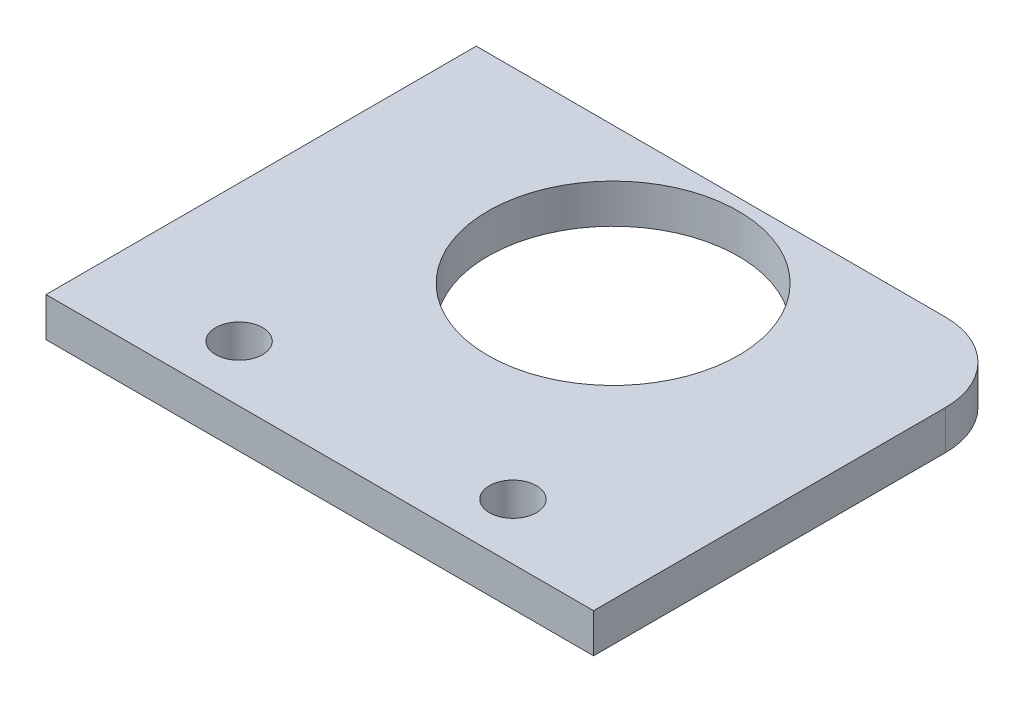
ISO-10303-21;
HEADER;
FILE_DESCRIPTION(('STEP AP214'),'2;1');
FILE_NAME('part.step','',(''),(''),'','','');
FILE_SCHEMA(('AUTOMOTIVE_DESIGN { 1 0 10303 214 1 1 1 1 }'));
ENDSEC;
DATA;
#1=APPLICATION_CONTEXT('core data for automotive mechanical design processes');
#2=APPLICATION_PROTOCOL_DEFINITION('international standard','automotive_design',2000,#1);
#3=PRODUCT_CONTEXT('',#1,'mechanical');
#4=PRODUCT('Part','Part','',(#3));
#5=PRODUCT_RELATED_PRODUCT_CATEGORY('part','',(#4));
#6=PRODUCT_DEFINITION_FORMATION('','',#4);
#7=PRODUCT_DEFINITION_CONTEXT('part definition',#1,'design');
#8=PRODUCT_DEFINITION('design','',#6,#7);
#9=PRODUCT_DEFINITION_SHAPE('','',#8);
#10=(LENGTH_UNIT() NAMED_UNIT(*) SI_UNIT(.MILLI.,.METRE.));
#11=(NAMED_UNIT(*) PLANE_ANGLE_UNIT() SI_UNIT($,.RADIAN.));
#12=(NAMED_UNIT(*) SI_UNIT($,.STERADIAN.) SOLID_ANGLE_UNIT());
#13=UNCERTAINTY_MEASURE_WITH_UNIT(LENGTH_MEASURE(1.E-05),#10,'distance_accuracy_value','');
#14=(GEOMETRIC_REPRESENTATION_CONTEXT(3) GLOBAL_UNCERTAINTY_ASSIGNED_CONTEXT((#13)) GLOBAL_UNIT_ASSIGNED_CONTEXT((#10,
#11,#12)) REPRESENTATION_CONTEXT('',''));
#15=CARTESIAN_POINT('',(0.,0.,0.));
#16=DIRECTION('',(0.,0.,1.));
#17=DIRECTION('',(1.,0.,0.));
#18=AXIS2_PLACEMENT_3D('',#15,#16,#17);
#19=CARTESIAN_POINT('',(0.,5.,0.));
#20=DIRECTION('',(0.,1.,0.));
#21=DIRECTION('',(0.,0.,1.));
#22=AXIS2_PLACEMENT_3D('',#19,#20,#21);
#23=PLANE('',#22);
#24=CARTESIAN_POINT('',(-17.5,5.,20.3108891324554));
#25=DIRECTION('',(0.,1.,0.));
#26=DIRECTION('',(0.,0.,1.));
#27=AXIS2_PLACEMENT_3D('',#24,#25,#26);
#28=CIRCLE('',#27,3.);
#29=CARTESIAN_POINT('',(-17.5,5.,23.3108891324554));
#30=VERTEX_POINT('',#29);
#31=EDGE_CURVE('E237',#30,#30,#28,.T.);
#32=ORIENTED_EDGE('',*,*,#31,.F.);
#33=EDGE_LOOP('',(#32));
#34=FACE_BOUND('',#33,.T.);
#35=CARTESIAN_POINT('',(17.5,5.,20.3108891324554));
#36=DIRECTION('',(0.,1.,0.));
#37=DIRECTION('',(0.,0.,1.));
#38=AXIS2_PLACEMENT_3D('',#35,#36,#37);
#39=CIRCLE('',#38,3.);
#40=CARTESIAN_POINT('',(17.5,5.,23.3108891324554));
#41=VERTEX_POINT('',#40);
#42=EDGE_CURVE('E235',#41,#41,#39,.T.);
#43=ORIENTED_EDGE('',*,*,#42,.F.);
#44=EDGE_LOOP('',(#43));
#45=FACE_BOUND('',#44,.T.);
#46=DIRECTION('',(0.,0.,-1.));
#47=VECTOR('',#46,1.);
#48=CARTESIAN_POINT('',(35.,5.,-27.5));
#49=LINE('',#48,#47);
#50=CARTESIAN_POINT('',(35.,5.,27.5));
#51=VERTEX_POINT('',#50);
#52=CARTESIAN_POINT('',(35.,5.,-17.5));
#53=VERTEX_POINT('',#52);
#54=EDGE_CURVE('E99',#51,#53,#49,.T.);
#55=ORIENTED_EDGE('',*,*,#54,.T.);
#56=CARTESIAN_POINT('',(25.,5.,-17.5));
#57=DIRECTION('',(0.,1.,0.));
#58=DIRECTION('',(0.,0.,1.));
#59=AXIS2_PLACEMENT_3D('',#56,#57,#58);
#60=CIRCLE('',#59,10.);
#61=CARTESIAN_POINT('',(25.,5.,-27.5));
#62=VERTEX_POINT('',#61);
#63=EDGE_CURVE('E11',#53,#62,#60,.T.);
#64=ORIENTED_EDGE('',*,*,#63,.T.);
#65=DIRECTION('',(-1.,0.,0.));
#66=VECTOR('',#65,1.);
#67=CARTESIAN_POINT('',(-35.,5.,-27.5));
#68=LINE('',#67,#66);
#69=CARTESIAN_POINT('',(-35.,5.,-27.5));
#70=VERTEX_POINT('',#69);
#71=EDGE_CURVE('E88',#62,#70,#68,.T.);
#72=ORIENTED_EDGE('',*,*,#71,.T.);
#73=DIRECTION('',(0.,0.,1.));
#74=VECTOR('',#73,1.);
#75=CARTESIAN_POINT('',(-35.,5.,-27.5));
#76=LINE('',#75,#74);
#77=CARTESIAN_POINT('',(-35.,5.,27.5));
#78=VERTEX_POINT('',#77);
#79=EDGE_CURVE('E92',#70,#78,#76,.T.);
#80=ORIENTED_EDGE('',*,*,#79,.T.);
#81=DIRECTION('',(1.,0.,0.));
#82=VECTOR('',#81,1.);
#83=CARTESIAN_POINT('',(-35.,5.,27.5));
#84=LINE('',#83,#82);
#85=EDGE_CURVE('E114',#78,#51,#84,.T.);
#86=ORIENTED_EDGE('',*,*,#85,.T.);
#87=EDGE_LOOP('',(#55,#64,#72,#80,#86));
#88=FACE_BOUND('',#87,.T.);
#89=CARTESIAN_POINT('',(0.,5.,-9.99999999999999));
#90=DIRECTION('',(0.,1.,0.));
#91=DIRECTION('',(0.,0.,1.));
#92=AXIS2_PLACEMENT_3D('',#89,#90,#91);
#93=CIRCLE('',#92,16.);
#94=CARTESIAN_POINT('',(0.,5.,6.00000000000001));
#95=VERTEX_POINT('',#94);
#96=EDGE_CURVE('E122',#95,#95,#93,.T.);
#97=ORIENTED_EDGE('',*,*,#96,.F.);
#98=EDGE_LOOP('',(#97));
#99=FACE_BOUND('',#98,.T.);
#100=ADVANCED_FACE('F42',(#34,#45,#88,#99),#23,.T.);
#101=CARTESIAN_POINT('',(0.,0.,0.));
#102=DIRECTION('',(0.,1.,0.));
#103=DIRECTION('',(0.,0.,1.));
#104=AXIS2_PLACEMENT_3D('',#101,#102,#103);
#105=PLANE('',#104);
#106=CARTESIAN_POINT('',(-17.5,0.,20.3108891324554));
#107=DIRECTION('',(0.,1.,0.));
#108=DIRECTION('',(0.,0.,1.));
#109=AXIS2_PLACEMENT_3D('',#106,#107,#108);
#110=CIRCLE('',#109,3.);
#111=CARTESIAN_POINT('',(-17.5,0.,23.3108891324554));
#112=VERTEX_POINT('',#111);
#113=EDGE_CURVE('E245',#112,#112,#110,.T.);
#114=ORIENTED_EDGE('',*,*,#113,.T.);
#115=EDGE_LOOP('',(#114));
#116=FACE_BOUND('',#115,.T.);
#117=CARTESIAN_POINT('',(17.5,0.,20.3108891324554));
#118=DIRECTION('',(0.,1.,0.));
#119=DIRECTION('',(0.,0.,1.));
#120=AXIS2_PLACEMENT_3D('',#117,#118,#119);
#121=CIRCLE('',#120,3.);
#122=CARTESIAN_POINT('',(17.5,0.,23.3108891324554));
#123=VERTEX_POINT('',#122);
#124=EDGE_CURVE('E232',#123,#123,#121,.T.);
#125=ORIENTED_EDGE('',*,*,#124,.T.);
#126=EDGE_LOOP('',(#125));
#127=FACE_BOUND('',#126,.T.);
#128=DIRECTION('',(-1.,0.,0.));
#129=VECTOR('',#128,1.);
#130=CARTESIAN_POINT('',(-35.,0.,-27.5));
#131=LINE('',#130,#129);
#132=CARTESIAN_POINT('',(25.,0.,-27.5));
#133=VERTEX_POINT('',#132);
#134=CARTESIAN_POINT('',(-35.,0.,-27.5));
#135=VERTEX_POINT('',#134);
#136=EDGE_CURVE('E104',#133,#135,#131,.T.);
#137=ORIENTED_EDGE('',*,*,#136,.F.);
#138=CARTESIAN_POINT('',(25.,0.,-17.5));
#139=DIRECTION('',(0.,1.,0.));
#140=DIRECTION('',(0.,0.,1.));
#141=AXIS2_PLACEMENT_3D('',#138,#139,#140);
#142=CIRCLE('',#141,10.);
#143=CARTESIAN_POINT('',(35.,0.,-17.5));
#144=VERTEX_POINT('',#143);
#145=EDGE_CURVE('E64',#133,#144,#142,.F.);
#146=ORIENTED_EDGE('',*,*,#145,.T.);
#147=DIRECTION('',(0.,0.,-1.));
#148=VECTOR('',#147,1.);
#149=CARTESIAN_POINT('',(35.,0.,-27.5));
#150=LINE('',#149,#148);
#151=CARTESIAN_POINT('',(35.,0.,27.5));
#152=VERTEX_POINT('',#151);
#153=EDGE_CURVE('E120',#152,#144,#150,.T.);
#154=ORIENTED_EDGE('',*,*,#153,.F.);
#155=DIRECTION('',(1.,0.,0.));
#156=VECTOR('',#155,1.);
#157=CARTESIAN_POINT('',(-35.,0.,27.5));
#158=LINE('',#157,#156);
#159=CARTESIAN_POINT('',(-35.,0.,27.5));
#160=VERTEX_POINT('',#159);
#161=EDGE_CURVE('E126',#160,#152,#158,.T.);
#162=ORIENTED_EDGE('',*,*,#161,.F.);
#163=DIRECTION('',(0.,0.,1.));
#164=VECTOR('',#163,1.);
#165=CARTESIAN_POINT('',(-35.,0.,-27.5));
#166=LINE('',#165,#164);
#167=EDGE_CURVE('E124',#135,#160,#166,.T.);
#168=ORIENTED_EDGE('',*,*,#167,.F.);
#169=EDGE_LOOP('',(#137,#146,#154,#162,#168));
#170=FACE_BOUND('',#169,.T.);
#171=CARTESIAN_POINT('',(0.,0.,-9.99999999999999));
#172=DIRECTION('',(0.,1.,0.));
#173=DIRECTION('',(0.,0.,1.));
#174=AXIS2_PLACEMENT_3D('',#171,#172,#173);
#175=CIRCLE('',#174,16.);
#176=CARTESIAN_POINT('',(0.,0.,6.00000000000001));
#177=VERTEX_POINT('',#176);
#178=EDGE_CURVE('E243',#177,#177,#175,.T.);
#179=ORIENTED_EDGE('',*,*,#178,.T.);
#180=EDGE_LOOP('',(#179));
#181=FACE_BOUND('',#180,.T.);
#182=ADVANCED_FACE('F133',(#116,#127,#170,#181),#105,.F.);
#183=CARTESIAN_POINT('',(35.,5.,-27.5));
#184=DIRECTION('',(-1.,0.,0.));
#185=DIRECTION('',(0.,0.,1.));
#186=AXIS2_PLACEMENT_3D('',#183,#184,#185);
#187=PLANE('',#186);
#188=ORIENTED_EDGE('',*,*,#153,.T.);
#189=DIRECTION('',(0.,-1.,0.));
#190=VECTOR('',#189,1.);
#191=CARTESIAN_POINT('',(35.,5.,-17.5));
#192=LINE('',#191,#190);
#193=EDGE_CURVE('E50',#144,#53,#192,.F.);
#194=ORIENTED_EDGE('',*,*,#193,.T.);
#195=ORIENTED_EDGE('',*,*,#54,.F.);
#196=DIRECTION('',(0.,-1.,0.));
#197=VECTOR('',#196,1.);
#198=CARTESIAN_POINT('',(35.,5.,27.5));
#199=LINE('',#198,#197);
#200=EDGE_CURVE('E116',#51,#152,#199,.T.);
#201=ORIENTED_EDGE('',*,*,#200,.T.);
#202=EDGE_LOOP('',(#188,#194,#195,#201));
#203=FACE_BOUND('',#202,.T.);
#204=ADVANCED_FACE('F153',(#203),#187,.F.);
#205=CARTESIAN_POINT('',(-35.,5.,-27.5));
#206=DIRECTION('',(0.,0.,1.));
#207=DIRECTION('',(1.,0.,0.));
#208=AXIS2_PLACEMENT_3D('',#205,#206,#207);
#209=PLANE('',#208);
#210=ORIENTED_EDGE('',*,*,#71,.F.);
#211=DIRECTION('',(0.,-1.,0.));
#212=VECTOR('',#211,1.);
#213=CARTESIAN_POINT('',(25.,5.,-27.5));
#214=LINE('',#213,#212);
#215=EDGE_CURVE('E107',#62,#133,#214,.T.);
#216=ORIENTED_EDGE('',*,*,#215,.T.);
#217=ORIENTED_EDGE('',*,*,#136,.T.);
#218=DIRECTION('',(0.,-1.,0.));
#219=VECTOR('',#218,1.);
#220=CARTESIAN_POINT('',(-35.,5.,-27.5));
#221=LINE('',#220,#219);
#222=EDGE_CURVE('E102',#70,#135,#221,.T.);
#223=ORIENTED_EDGE('',*,*,#222,.F.);
#224=EDGE_LOOP('',(#210,#216,#217,#223));
#225=FACE_BOUND('',#224,.T.);
#226=ADVANCED_FACE('F103',(#225),#209,.F.);
#227=CARTESIAN_POINT('',(-35.,5.,-27.5));
#228=DIRECTION('',(1.,0.,0.));
#229=DIRECTION('',(0.,0.,-1.));
#230=AXIS2_PLACEMENT_3D('',#227,#228,#229);
#231=PLANE('',#230);
#232=ORIENTED_EDGE('',*,*,#167,.T.);
#233=DIRECTION('',(0.,-1.,0.));
#234=VECTOR('',#233,1.);
#235=CARTESIAN_POINT('',(-35.,5.,27.5));
#236=LINE('',#235,#234);
#237=EDGE_CURVE('E108',#78,#160,#236,.T.);
#238=ORIENTED_EDGE('',*,*,#237,.F.);
#239=ORIENTED_EDGE('',*,*,#79,.F.);
#240=ORIENTED_EDGE('',*,*,#222,.T.);
#241=EDGE_LOOP('',(#232,#238,#239,#240));
#242=FACE_BOUND('',#241,.T.);
#243=ADVANCED_FACE('F110',(#242),#231,.F.);
#244=CARTESIAN_POINT('',(-35.,5.,27.5));
#245=DIRECTION('',(0.,0.,-1.));
#246=DIRECTION('',(-1.,0.,0.));
#247=AXIS2_PLACEMENT_3D('',#244,#245,#246);
#248=PLANE('',#247);
#249=ORIENTED_EDGE('',*,*,#161,.T.);
#250=ORIENTED_EDGE('',*,*,#200,.F.);
#251=ORIENTED_EDGE('',*,*,#85,.F.);
#252=ORIENTED_EDGE('',*,*,#237,.T.);
#253=EDGE_LOOP('',(#249,#250,#251,#252));
#254=FACE_BOUND('',#253,.T.);
#255=ADVANCED_FACE('F137',(#254),#248,.F.);
#256=CARTESIAN_POINT('',(0.,5.,-9.99999999999999));
#257=DIRECTION('',(0.,-1.,0.));
#258=DIRECTION('',(0.,0.,-1.));
#259=AXIS2_PLACEMENT_3D('',#256,#257,#258);
#260=CYLINDRICAL_SURFACE('',#259,16.);
#261=ORIENTED_EDGE('',*,*,#96,.T.);
#262=EDGE_LOOP('',(#261));
#263=FACE_BOUND('',#262,.T.);
#264=ORIENTED_EDGE('',*,*,#178,.F.);
#265=EDGE_LOOP('',(#264));
#266=FACE_BOUND('',#265,.T.);
#267=ADVANCED_FACE('F159',(#263,#266),#260,.F.);
#268=CARTESIAN_POINT('',(17.5,0.,20.3108891324554));
#269=DIRECTION('',(0.,1.,0.));
#270=DIRECTION('',(0.,0.,1.));
#271=AXIS2_PLACEMENT_3D('',#268,#269,#270);
#272=CYLINDRICAL_SURFACE('',#271,3.);
#273=ORIENTED_EDGE('',*,*,#124,.F.);
#274=EDGE_LOOP('',(#273));
#275=FACE_BOUND('',#274,.T.);
#276=ORIENTED_EDGE('',*,*,#42,.T.);
#277=EDGE_LOOP('',(#276));
#278=FACE_BOUND('',#277,.T.);
#279=ADVANCED_FACE('F144',(#275,#278),#272,.F.);
#280=CARTESIAN_POINT('',(-17.5,0.,20.3108891324554));
#281=DIRECTION('',(0.,1.,0.));
#282=DIRECTION('',(0.,0.,1.));
#283=AXIS2_PLACEMENT_3D('',#280,#281,#282);
#284=CYLINDRICAL_SURFACE('',#283,3.);
#285=ORIENTED_EDGE('',*,*,#113,.F.);
#286=EDGE_LOOP('',(#285));
#287=FACE_BOUND('',#286,.T.);
#288=ORIENTED_EDGE('',*,*,#31,.T.);
#289=EDGE_LOOP('',(#288));
#290=FACE_BOUND('',#289,.T.);
#291=ADVANCED_FACE('F140',(#287,#290),#284,.F.);
#292=CARTESIAN_POINT('',(25.,5.,-17.5));
#293=DIRECTION('',(0.,-1.,0.));
#294=DIRECTION('',(0.,0.,-1.));
#295=AXIS2_PLACEMENT_3D('',#292,#293,#294);
#296=CYLINDRICAL_SURFACE('',#295,10.);
#297=ORIENTED_EDGE('',*,*,#63,.F.);
#298=ORIENTED_EDGE('',*,*,#193,.F.);
#299=ORIENTED_EDGE('',*,*,#145,.F.);
#300=ORIENTED_EDGE('',*,*,#215,.F.);
#301=EDGE_LOOP('',(#297,#298,#299,#300));
#302=FACE_BOUND('',#301,.T.);
#303=ADVANCED_FACE('F44',(#302),#296,.T.);
#304=CLOSED_SHELL('',(#100,#182,#204,#226,#243,#255,#267,#279,#291,#303));
#305=MANIFOLD_SOLID_BREP('B2',#304);
#306=ADVANCED_BREP_SHAPE_REPRESENTATION('',(#18,#305),#14);
#307=SHAPE_DEFINITION_REPRESENTATION(#9,#306);
ENDSEC;
END-ISO-10303-21;
